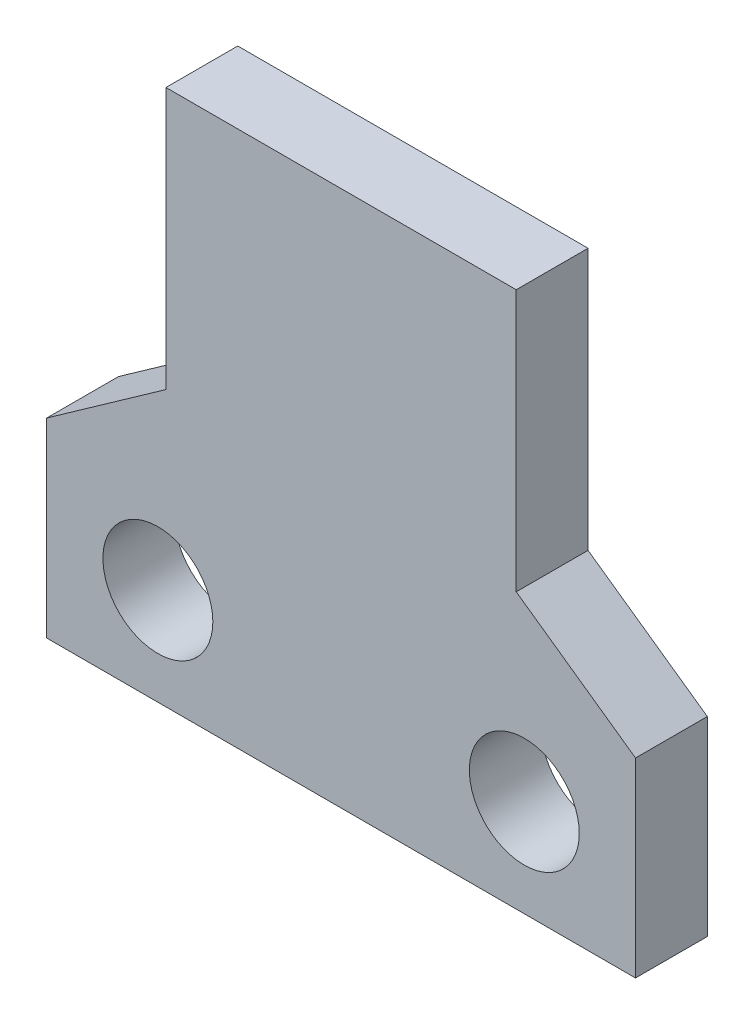
ISO-10303-21;
HEADER;
FILE_DESCRIPTION(('STEP AP214'),'2;1');
FILE_NAME('part.step','',(''),(''),'','','');
FILE_SCHEMA(('AUTOMOTIVE_DESIGN { 1 0 10303 214 1 1 1 1 }'));
ENDSEC;
DATA;
#1=APPLICATION_CONTEXT('core data for automotive mechanical design processes');
#2=APPLICATION_PROTOCOL_DEFINITION('international standard','automotive_design',2000,#1);
#3=PRODUCT_CONTEXT('',#1,'mechanical');
#4=PRODUCT('Part','Part','',(#3));
#5=PRODUCT_RELATED_PRODUCT_CATEGORY('part','',(#4));
#6=PRODUCT_DEFINITION_FORMATION('','',#4);
#7=PRODUCT_DEFINITION_CONTEXT('part definition',#1,'design');
#8=PRODUCT_DEFINITION('design','',#6,#7);
#9=PRODUCT_DEFINITION_SHAPE('','',#8);
#10=(LENGTH_UNIT() NAMED_UNIT(*) SI_UNIT(.MILLI.,.METRE.));
#11=(NAMED_UNIT(*) PLANE_ANGLE_UNIT() SI_UNIT($,.RADIAN.));
#12=(NAMED_UNIT(*) SI_UNIT($,.STERADIAN.) SOLID_ANGLE_UNIT());
#13=UNCERTAINTY_MEASURE_WITH_UNIT(LENGTH_MEASURE(1.E-05),#10,'distance_accuracy_value','');
#14=(GEOMETRIC_REPRESENTATION_CONTEXT(3) GLOBAL_UNCERTAINTY_ASSIGNED_CONTEXT((#13)) GLOBAL_UNIT_ASSIGNED_CONTEXT((#10,
#11,#12)) REPRESENTATION_CONTEXT('',''));
#15=CARTESIAN_POINT('',(0.,0.,0.));
#16=DIRECTION('',(0.,0.,1.));
#17=DIRECTION('',(1.,0.,0.));
#18=AXIS2_PLACEMENT_3D('',#15,#16,#17);
#19=CARTESIAN_POINT('',(-8.03500000000001,-7.32,-1.96));
#20=DIRECTION('',(-1.,0.,0.));
#21=DIRECTION('',(0.,0.,1.));
#22=AXIS2_PLACEMENT_3D('',#19,#20,#21);
#23=PLANE('',#22);
#24=DIRECTION('',(0.,-1.,0.));
#25=VECTOR('',#24,1.);
#26=CARTESIAN_POINT('',(-8.03500000000001,-7.32,0.));
#27=LINE('',#26,#25);
#28=CARTESIAN_POINT('',(-8.03500000000001,-2.12,0.));
#29=VERTEX_POINT('',#28);
#30=CARTESIAN_POINT('',(-8.03500000000001,-7.32,0.));
#31=VERTEX_POINT('',#30);
#32=EDGE_CURVE('E140',#29,#31,#27,.T.);
#33=ORIENTED_EDGE('',*,*,#32,.F.);
#34=DIRECTION('',(0.,0.,1.));
#35=VECTOR('',#34,1.);
#36=CARTESIAN_POINT('',(-8.03500000000001,-2.12,-1.96));
#37=LINE('',#36,#35);
#38=CARTESIAN_POINT('',(-8.03500000000001,-2.12,-1.96));
#39=VERTEX_POINT('',#38);
#40=EDGE_CURVE('E138',#39,#29,#37,.T.);
#41=ORIENTED_EDGE('',*,*,#40,.F.);
#42=DIRECTION('',(0.,-1.,0.));
#43=VECTOR('',#42,1.);
#44=CARTESIAN_POINT('',(-8.03500000000001,-7.32,-1.96));
#45=LINE('',#44,#43);
#46=CARTESIAN_POINT('',(-8.03500000000001,-7.32,-1.96));
#47=VERTEX_POINT('',#46);
#48=EDGE_CURVE('E123',#39,#47,#45,.T.);
#49=ORIENTED_EDGE('',*,*,#48,.T.);
#50=DIRECTION('',(0.,0.,1.));
#51=VECTOR('',#50,1.);
#52=CARTESIAN_POINT('',(-8.03500000000001,-7.32,-1.96));
#53=LINE('',#52,#51);
#54=EDGE_CURVE('E38',#47,#31,#53,.T.);
#55=ORIENTED_EDGE('',*,*,#54,.T.);
#56=EDGE_LOOP('',(#33,#41,#49,#55));
#57=FACE_BOUND('',#56,.T.);
#58=ADVANCED_FACE('F34',(#57),#23,.T.);
#59=CARTESIAN_POINT('',(-8.03500000000001,7.32,-1.96));
#60=DIRECTION('',(0.,1.,0.));
#61=DIRECTION('',(0.,0.,1.));
#62=AXIS2_PLACEMENT_3D('',#59,#60,#61);
#63=PLANE('',#62);
#64=DIRECTION('',(0.,0.,1.));
#65=VECTOR('',#64,1.);
#66=CARTESIAN_POINT('',(4.78,7.32,-1.96));
#67=LINE('',#66,#65);
#68=CARTESIAN_POINT('',(4.78,7.32,-1.96));
#69=VERTEX_POINT('',#68);
#70=CARTESIAN_POINT('',(4.78,7.32,0.));
#71=VERTEX_POINT('',#70);
#72=EDGE_CURVE('E102',#69,#71,#67,.T.);
#73=ORIENTED_EDGE('',*,*,#72,.F.);
#74=DIRECTION('',(-1.,0.,0.));
#75=VECTOR('',#74,1.);
#76=CARTESIAN_POINT('',(-8.03500000000001,7.32,-1.96));
#77=LINE('',#76,#75);
#78=CARTESIAN_POINT('',(-4.78,7.32,-1.96));
#79=VERTEX_POINT('',#78);
#80=EDGE_CURVE('E115',#69,#79,#77,.T.);
#81=ORIENTED_EDGE('',*,*,#80,.T.);
#82=DIRECTION('',(0.,0.,1.));
#83=VECTOR('',#82,1.);
#84=CARTESIAN_POINT('',(-4.78,7.32,-1.96));
#85=LINE('',#84,#83);
#86=CARTESIAN_POINT('',(-4.78,7.32,0.));
#87=VERTEX_POINT('',#86);
#88=EDGE_CURVE('E170',#79,#87,#85,.T.);
#89=ORIENTED_EDGE('',*,*,#88,.T.);
#90=DIRECTION('',(-1.,0.,0.));
#91=VECTOR('',#90,1.);
#92=CARTESIAN_POINT('',(-8.03500000000001,7.32,0.));
#93=LINE('',#92,#91);
#94=EDGE_CURVE('E117',#71,#87,#93,.T.);
#95=ORIENTED_EDGE('',*,*,#94,.F.);
#96=EDGE_LOOP('',(#73,#81,#89,#95));
#97=FACE_BOUND('',#96,.T.);
#98=ADVANCED_FACE('F113',(#97),#63,.T.);
#99=CARTESIAN_POINT('',(0.,0.,-1.96));
#100=DIRECTION('',(0.,0.,-1.));
#101=DIRECTION('',(-1.,0.,0.));
#102=AXIS2_PLACEMENT_3D('',#99,#100,#101);
#103=PLANE('',#102);
#104=CARTESIAN_POINT('',(5.,-4.67,-1.96));
#105=DIRECTION('',(0.,0.,1.));
#106=DIRECTION('',(1.,0.,0.));
#107=AXIS2_PLACEMENT_3D('',#104,#105,#106);
#108=CIRCLE('',#107,1.5);
#109=CARTESIAN_POINT('',(6.5,-4.67,-1.96));
#110=VERTEX_POINT('',#109);
#111=EDGE_CURVE('E182',#110,#110,#108,.T.);
#112=ORIENTED_EDGE('',*,*,#111,.T.);
#113=EDGE_LOOP('',(#112));
#114=FACE_BOUND('',#113,.T.);
#115=CARTESIAN_POINT('',(-5.,-4.67,-1.96));
#116=DIRECTION('',(0.,0.,1.));
#117=DIRECTION('',(1.,0.,0.));
#118=AXIS2_PLACEMENT_3D('',#115,#116,#117);
#119=CIRCLE('',#118,1.5);
#120=CARTESIAN_POINT('',(-3.5,-4.67,-1.96));
#121=VERTEX_POINT('',#120);
#122=EDGE_CURVE('E175',#121,#121,#119,.T.);
#123=ORIENTED_EDGE('',*,*,#122,.T.);
#124=EDGE_LOOP('',(#123));
#125=FACE_BOUND('',#124,.T.);
#126=DIRECTION('',(0.816689630844431,-0.577077158507584,0.));
#127=VECTOR('',#126,1.);
#128=CARTESIAN_POINT('',(1.67665899172333,2.37283696437368,-1.96));
#129=LINE('',#128,#127);
#130=CARTESIAN_POINT('',(4.78,0.179999999999997,-1.96));
#131=VERTEX_POINT('',#130);
#132=CARTESIAN_POINT('',(8.03499999999999,-2.11999999999999,-1.96));
#133=VERTEX_POINT('',#132);
#134=EDGE_CURVE('E109',#131,#133,#129,.T.);
#135=ORIENTED_EDGE('',*,*,#134,.T.);
#136=DIRECTION('',(0.,1.,0.));
#137=VECTOR('',#136,1.);
#138=CARTESIAN_POINT('',(8.03499999999999,-7.32,-1.96));
#139=LINE('',#138,#137);
#140=CARTESIAN_POINT('',(8.03499999999999,-7.32,-1.96));
#141=VERTEX_POINT('',#140);
#142=EDGE_CURVE('E124',#141,#133,#139,.T.);
#143=ORIENTED_EDGE('',*,*,#142,.F.);
#144=DIRECTION('',(1.,0.,0.));
#145=VECTOR('',#144,1.);
#146=CARTESIAN_POINT('',(-8.03500000000001,-7.32,-1.96));
#147=LINE('',#146,#145);
#148=EDGE_CURVE('E126',#47,#141,#147,.T.);
#149=ORIENTED_EDGE('',*,*,#148,.F.);
#150=ORIENTED_EDGE('',*,*,#48,.F.);
#151=DIRECTION('',(-0.81668963084443,-0.577077158507585,0.));
#152=VECTOR('',#151,1.);
#153=CARTESIAN_POINT('',(-1.67665899172333,2.37283696437368,-1.96));
#154=LINE('',#153,#152);
#155=CARTESIAN_POINT('',(-4.78,0.179999999999997,-1.96));
#156=VERTEX_POINT('',#155);
#157=EDGE_CURVE('E163',#156,#39,#154,.T.);
#158=ORIENTED_EDGE('',*,*,#157,.F.);
#159=DIRECTION('',(0.,-1.,0.));
#160=VECTOR('',#159,1.);
#161=CARTESIAN_POINT('',(-4.78,0.,-1.96));
#162=LINE('',#161,#160);
#163=EDGE_CURVE('E122',#79,#156,#162,.T.);
#164=ORIENTED_EDGE('',*,*,#163,.F.);
#165=ORIENTED_EDGE('',*,*,#80,.F.);
#166=DIRECTION('',(0.,-1.,0.));
#167=VECTOR('',#166,1.);
#168=CARTESIAN_POINT('',(4.78,0.,-1.96));
#169=LINE('',#168,#167);
#170=EDGE_CURVE('E98',#69,#131,#169,.T.);
#171=ORIENTED_EDGE('',*,*,#170,.T.);
#172=EDGE_LOOP('',(#135,#143,#149,#150,#158,#164,#165,#171));
#173=FACE_BOUND('',#172,.T.);
#174=ADVANCED_FACE('F120',(#114,#125,#173),#103,.T.);
#175=CARTESIAN_POINT('',(0.,0.,0.));
#176=DIRECTION('',(0.,0.,-1.));
#177=DIRECTION('',(-1.,0.,0.));
#178=AXIS2_PLACEMENT_3D('',#175,#176,#177);
#179=PLANE('',#178);
#180=CARTESIAN_POINT('',(5.,-4.67,0.));
#181=DIRECTION('',(0.,0.,1.));
#182=DIRECTION('',(1.,0.,0.));
#183=AXIS2_PLACEMENT_3D('',#180,#181,#182);
#184=CIRCLE('',#183,1.5);
#185=CARTESIAN_POINT('',(6.5,-4.67,0.));
#186=VERTEX_POINT('',#185);
#187=EDGE_CURVE('E184',#186,#186,#184,.T.);
#188=ORIENTED_EDGE('',*,*,#187,.F.);
#189=EDGE_LOOP('',(#188));
#190=FACE_BOUND('',#189,.T.);
#191=CARTESIAN_POINT('',(-5.,-4.67,0.));
#192=DIRECTION('',(0.,0.,1.));
#193=DIRECTION('',(1.,0.,0.));
#194=AXIS2_PLACEMENT_3D('',#191,#192,#193);
#195=CIRCLE('',#194,1.5);
#196=CARTESIAN_POINT('',(-3.5,-4.67,0.));
#197=VERTEX_POINT('',#196);
#198=EDGE_CURVE('E177',#197,#197,#195,.T.);
#199=ORIENTED_EDGE('',*,*,#198,.F.);
#200=EDGE_LOOP('',(#199));
#201=FACE_BOUND('',#200,.T.);
#202=DIRECTION('',(0.,1.,0.));
#203=VECTOR('',#202,1.);
#204=CARTESIAN_POINT('',(8.03499999999999,-7.32,0.));
#205=LINE('',#204,#203);
#206=CARTESIAN_POINT('',(8.03499999999999,-7.32,0.));
#207=VERTEX_POINT('',#206);
#208=CARTESIAN_POINT('',(8.03499999999999,-2.11999999999999,0.));
#209=VERTEX_POINT('',#208);
#210=EDGE_CURVE('E135',#207,#209,#205,.T.);
#211=ORIENTED_EDGE('',*,*,#210,.T.);
#212=DIRECTION('',(0.816689630844431,-0.577077158507584,0.));
#213=VECTOR('',#212,1.);
#214=CARTESIAN_POINT('',(1.67665899172333,2.37283696437368,0.));
#215=LINE('',#214,#213);
#216=CARTESIAN_POINT('',(4.78,0.179999999999997,0.));
#217=VERTEX_POINT('',#216);
#218=EDGE_CURVE('E49',#217,#209,#215,.T.);
#219=ORIENTED_EDGE('',*,*,#218,.F.);
#220=DIRECTION('',(0.,-1.,0.));
#221=VECTOR('',#220,1.);
#222=CARTESIAN_POINT('',(4.78,0.,0.));
#223=LINE('',#222,#221);
#224=EDGE_CURVE('E174',#71,#217,#223,.T.);
#225=ORIENTED_EDGE('',*,*,#224,.F.);
#226=ORIENTED_EDGE('',*,*,#94,.T.);
#227=DIRECTION('',(0.,-1.,0.));
#228=VECTOR('',#227,1.);
#229=CARTESIAN_POINT('',(-4.78,0.,0.));
#230=LINE('',#229,#228);
#231=CARTESIAN_POINT('',(-4.78,0.179999999999997,0.));
#232=VERTEX_POINT('',#231);
#233=EDGE_CURVE('E157',#87,#232,#230,.T.);
#234=ORIENTED_EDGE('',*,*,#233,.T.);
#235=DIRECTION('',(-0.81668963084443,-0.577077158507585,0.));
#236=VECTOR('',#235,1.);
#237=CARTESIAN_POINT('',(-1.67665899172333,2.37283696437368,0.));
#238=LINE('',#237,#236);
#239=EDGE_CURVE('E57',#232,#29,#238,.T.);
#240=ORIENTED_EDGE('',*,*,#239,.T.);
#241=ORIENTED_EDGE('',*,*,#32,.T.);
#242=DIRECTION('',(1.,0.,0.));
#243=VECTOR('',#242,1.);
#244=CARTESIAN_POINT('',(-8.03500000000001,-7.32,0.));
#245=LINE('',#244,#243);
#246=EDGE_CURVE('E129',#31,#207,#245,.T.);
#247=ORIENTED_EDGE('',*,*,#246,.T.);
#248=EDGE_LOOP('',(#211,#219,#225,#226,#234,#240,#241,#247));
#249=FACE_BOUND('',#248,.T.);
#250=ADVANCED_FACE('F145',(#190,#201,#249),#179,.F.);
#251=CARTESIAN_POINT('',(8.03499999999999,-7.32,-1.96));
#252=DIRECTION('',(1.,0.,0.));
#253=DIRECTION('',(0.,0.,-1.));
#254=AXIS2_PLACEMENT_3D('',#251,#252,#253);
#255=PLANE('',#254);
#256=DIRECTION('',(0.,0.,1.));
#257=VECTOR('',#256,1.);
#258=CARTESIAN_POINT('',(8.03499999999999,-2.11999999999999,-1.96));
#259=LINE('',#258,#257);
#260=EDGE_CURVE('E155',#133,#209,#259,.T.);
#261=ORIENTED_EDGE('',*,*,#260,.T.);
#262=ORIENTED_EDGE('',*,*,#210,.F.);
#263=DIRECTION('',(0.,0.,1.));
#264=VECTOR('',#263,1.);
#265=CARTESIAN_POINT('',(8.03499999999999,-7.32,-1.96));
#266=LINE('',#265,#264);
#267=EDGE_CURVE('E11',#141,#207,#266,.T.);
#268=ORIENTED_EDGE('',*,*,#267,.F.);
#269=ORIENTED_EDGE('',*,*,#142,.T.);
#270=EDGE_LOOP('',(#261,#262,#268,#269));
#271=FACE_BOUND('',#270,.T.);
#272=ADVANCED_FACE('F36',(#271),#255,.T.);
#273=CARTESIAN_POINT('',(-8.03500000000001,-7.32,-1.96));
#274=DIRECTION('',(0.,-1.,0.));
#275=DIRECTION('',(0.,0.,-1.));
#276=AXIS2_PLACEMENT_3D('',#273,#274,#275);
#277=PLANE('',#276);
#278=ORIENTED_EDGE('',*,*,#246,.F.);
#279=ORIENTED_EDGE('',*,*,#54,.F.);
#280=ORIENTED_EDGE('',*,*,#148,.T.);
#281=ORIENTED_EDGE('',*,*,#267,.T.);
#282=EDGE_LOOP('',(#278,#279,#280,#281));
#283=FACE_BOUND('',#282,.T.);
#284=ADVANCED_FACE('F151',(#283),#277,.T.);
#285=CARTESIAN_POINT('',(-1.67665899172333,2.37283696437368,-1.96));
#286=DIRECTION('',(-0.577077158507585,0.81668963084443,0.));
#287=DIRECTION('',(-0.81668963084443,-0.577077158507585,0.));
#288=AXIS2_PLACEMENT_3D('',#285,#286,#287);
#289=PLANE('',#288);
#290=ORIENTED_EDGE('',*,*,#239,.F.);
#291=DIRECTION('',(0.,0.,1.));
#292=VECTOR('',#291,1.);
#293=CARTESIAN_POINT('',(-4.78,0.179999999999997,-1.96));
#294=LINE('',#293,#292);
#295=EDGE_CURVE('E165',#156,#232,#294,.T.);
#296=ORIENTED_EDGE('',*,*,#295,.F.);
#297=ORIENTED_EDGE('',*,*,#157,.T.);
#298=ORIENTED_EDGE('',*,*,#40,.T.);
#299=EDGE_LOOP('',(#290,#296,#297,#298));
#300=FACE_BOUND('',#299,.T.);
#301=ADVANCED_FACE('F222',(#300),#289,.T.);
#302=CARTESIAN_POINT('',(-4.78,0.,-1.96));
#303=DIRECTION('',(-1.,0.,0.));
#304=DIRECTION('',(0.,-1.,0.));
#305=AXIS2_PLACEMENT_3D('',#302,#303,#304);
#306=PLANE('',#305);
#307=ORIENTED_EDGE('',*,*,#233,.F.);
#308=ORIENTED_EDGE('',*,*,#88,.F.);
#309=ORIENTED_EDGE('',*,*,#163,.T.);
#310=ORIENTED_EDGE('',*,*,#295,.T.);
#311=EDGE_LOOP('',(#307,#308,#309,#310));
#312=FACE_BOUND('',#311,.T.);
#313=ADVANCED_FACE('F173',(#312),#306,.T.);
#314=CARTESIAN_POINT('',(1.67665899172333,2.37283696437368,-1.96));
#315=DIRECTION('',(-0.577077158507584,-0.816689630844431,0.));
#316=DIRECTION('',(0.816689630844431,-0.577077158507584,0.));
#317=AXIS2_PLACEMENT_3D('',#314,#315,#316);
#318=PLANE('',#317);
#319=ORIENTED_EDGE('',*,*,#218,.T.);
#320=ORIENTED_EDGE('',*,*,#260,.F.);
#321=ORIENTED_EDGE('',*,*,#134,.F.);
#322=DIRECTION('',(0.,0.,1.));
#323=VECTOR('',#322,1.);
#324=CARTESIAN_POINT('',(4.78,0.179999999999997,-1.96));
#325=LINE('',#324,#323);
#326=EDGE_CURVE('E104',#131,#217,#325,.T.);
#327=ORIENTED_EDGE('',*,*,#326,.T.);
#328=EDGE_LOOP('',(#319,#320,#321,#327));
#329=FACE_BOUND('',#328,.T.);
#330=ADVANCED_FACE('F210',(#329),#318,.F.);
#331=CARTESIAN_POINT('',(4.78,0.,-1.96));
#332=DIRECTION('',(-1.,0.,0.));
#333=DIRECTION('',(0.,-1.,0.));
#334=AXIS2_PLACEMENT_3D('',#331,#332,#333);
#335=PLANE('',#334);
#336=ORIENTED_EDGE('',*,*,#224,.T.);
#337=ORIENTED_EDGE('',*,*,#326,.F.);
#338=ORIENTED_EDGE('',*,*,#170,.F.);
#339=ORIENTED_EDGE('',*,*,#72,.T.);
#340=EDGE_LOOP('',(#336,#337,#338,#339));
#341=FACE_BOUND('',#340,.T.);
#342=ADVANCED_FACE('F101',(#341),#335,.F.);
#343=CARTESIAN_POINT('',(-5.,-4.67,-1.96));
#344=DIRECTION('',(0.,0.,1.));
#345=DIRECTION('',(1.,0.,0.));
#346=AXIS2_PLACEMENT_3D('',#343,#344,#345);
#347=CYLINDRICAL_SURFACE('',#346,1.5);
#348=ORIENTED_EDGE('',*,*,#122,.F.);
#349=EDGE_LOOP('',(#348));
#350=FACE_BOUND('',#349,.T.);
#351=ORIENTED_EDGE('',*,*,#198,.T.);
#352=EDGE_LOOP('',(#351));
#353=FACE_BOUND('',#352,.T.);
#354=ADVANCED_FACE('F195',(#350,#353),#347,.F.);
#355=CARTESIAN_POINT('',(5.,-4.67,-1.96));
#356=DIRECTION('',(0.,0.,1.));
#357=DIRECTION('',(1.,0.,0.));
#358=AXIS2_PLACEMENT_3D('',#355,#356,#357);
#359=CYLINDRICAL_SURFACE('',#358,1.5);
#360=ORIENTED_EDGE('',*,*,#111,.F.);
#361=EDGE_LOOP('',(#360));
#362=FACE_BOUND('',#361,.T.);
#363=ORIENTED_EDGE('',*,*,#187,.T.);
#364=EDGE_LOOP('',(#363));
#365=FACE_BOUND('',#364,.T.);
#366=ADVANCED_FACE('F192',(#362,#365),#359,.F.);
#367=CLOSED_SHELL('',(#58,#98,#174,#250,#272,#284,#301,#313,#330,#342,#354,#366));
#368=MANIFOLD_SOLID_BREP('B2',#367);
#369=ADVANCED_BREP_SHAPE_REPRESENTATION('',(#18,#368),#14);
#370=SHAPE_DEFINITION_REPRESENTATION(#9,#369);
ENDSEC;
END-ISO-10303-21;
